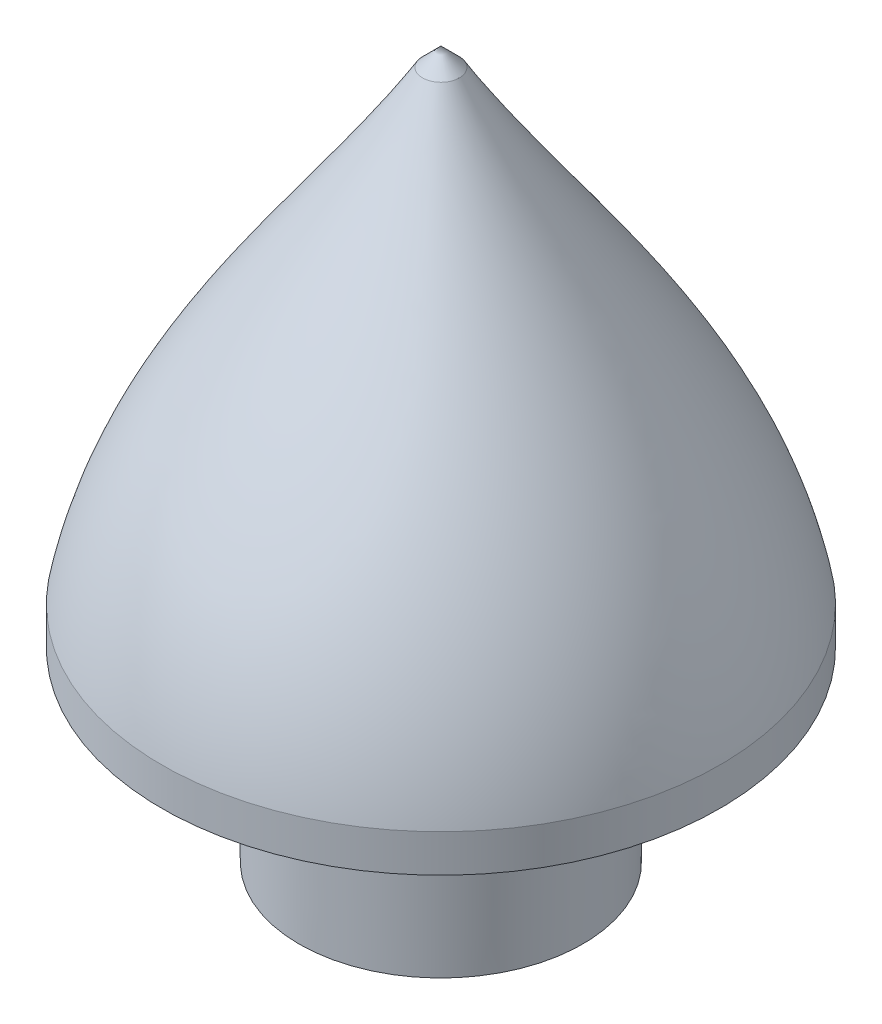
ISO-10303-21;
HEADER;
FILE_DESCRIPTION(('STEP AP214'),'2;1');
FILE_NAME('part.step','',(''),(''),'','','');
FILE_SCHEMA(('AUTOMOTIVE_DESIGN { 1 0 10303 214 1 1 1 1 }'));
ENDSEC;
DATA;
#1=APPLICATION_CONTEXT('core data for automotive mechanical design processes');
#2=APPLICATION_PROTOCOL_DEFINITION('international standard','automotive_design',2000,#1);
#3=PRODUCT_CONTEXT('',#1,'mechanical');
#4=PRODUCT('Part','Part','',(#3));
#5=PRODUCT_RELATED_PRODUCT_CATEGORY('part','',(#4));
#6=PRODUCT_DEFINITION_FORMATION('','',#4);
#7=PRODUCT_DEFINITION_CONTEXT('part definition',#1,'design');
#8=PRODUCT_DEFINITION('design','',#6,#7);
#9=PRODUCT_DEFINITION_SHAPE('','',#8);
#10=(LENGTH_UNIT() NAMED_UNIT(*) SI_UNIT(.MILLI.,.METRE.));
#11=(NAMED_UNIT(*) PLANE_ANGLE_UNIT() SI_UNIT($,.RADIAN.));
#12=(NAMED_UNIT(*) SI_UNIT($,.STERADIAN.) SOLID_ANGLE_UNIT());
#13=UNCERTAINTY_MEASURE_WITH_UNIT(LENGTH_MEASURE(1.E-05),#10,'distance_accuracy_value','');
#14=(GEOMETRIC_REPRESENTATION_CONTEXT(3) GLOBAL_UNCERTAINTY_ASSIGNED_CONTEXT((#13)) GLOBAL_UNIT_ASSIGNED_CONTEXT((#10,
#11,#12)) REPRESENTATION_CONTEXT('',''));
#15=CARTESIAN_POINT('',(0.,0.,0.));
#16=DIRECTION('',(0.,0.,1.));
#17=DIRECTION('',(1.,0.,0.));
#18=AXIS2_PLACEMENT_3D('',#15,#16,#17);
#19=CARTESIAN_POINT('',(-2.,0.,0.));
#20=DIRECTION('',(0.,1.,0.));
#21=DIRECTION('',(0.,0.,1.));
#22=AXIS2_PLACEMENT_3D('',#19,#20,#21);
#23=PLANE('',#22);
#24=CARTESIAN_POINT('',(0.,0.,0.));
#25=DIRECTION('',(0.,-1.,0.));
#26=DIRECTION('',(0.,0.,-1.));
#27=AXIS2_PLACEMENT_3D('',#24,#25,#26);
#28=CIRCLE('',#27,3.75);
#29=CARTESIAN_POINT('',(0.,0.,-3.75));
#30=VERTEX_POINT('',#29);
#31=EDGE_CURVE('E59',#30,#30,#28,.T.);
#32=ORIENTED_EDGE('',*,*,#31,.T.);
#33=EDGE_LOOP('',(#32));
#34=FACE_BOUND('',#33,.T.);
#35=CARTESIAN_POINT('',(0.,0.,0.));
#36=DIRECTION('',(0.,1.,0.));
#37=DIRECTION('',(0.,0.,1.));
#38=AXIS2_PLACEMENT_3D('',#35,#36,#37);
#39=CIRCLE('',#38,1.95);
#40=CARTESIAN_POINT('',(0.,0.,1.95));
#41=VERTEX_POINT('',#40);
#42=EDGE_CURVE('E11',#41,#41,#39,.F.);
#43=ORIENTED_EDGE('',*,*,#42,.F.);
#44=EDGE_LOOP('',(#43));
#45=FACE_BOUND('',#44,.T.);
#46=ADVANCED_FACE('F33',(#34,#45),#23,.F.);
#47=CARTESIAN_POINT('',(0.,7.,0.));
#48=DIRECTION('',(0.,-1.,0.));
#49=DIRECTION('',(0.,0.,-1.));
#50=AXIS2_PLACEMENT_3D('',#47,#48,#49);
#51=CONICAL_SURFACE('',#50,0.,0.785398163397438);
#52=CARTESIAN_POINT('',(0.,6.75257649370923,0.));
#53=DIRECTION('',(0.,-1.,0.));
#54=DIRECTION('',(0.,0.,-1.));
#55=AXIS2_PLACEMENT_3D('',#52,#53,#54);
#56=CIRCLE('',#55,0.247423506290761);
#57=CARTESIAN_POINT('',(0.,6.75257649370923,-0.247423506290761));
#58=VERTEX_POINT('',#57);
#59=EDGE_CURVE('E40',#58,#58,#56,.T.);
#60=ORIENTED_EDGE('',*,*,#59,.F.);
#61=EDGE_LOOP('',(#60));
#62=FACE_BOUND('',#61,.T.);
#63=CARTESIAN_POINT('',(0.,7.,0.));
#64=VERTEX_POINT('',#63);
#65=VERTEX_LOOP('',#64);
#66=FACE_BOUND('',#65,.T.);
#67=ADVANCED_FACE('F35',(#62,#66),#51,.T.);
#68=CARTESIAN_POINT('',(-0.247423506290761,6.75257649370924,0.));
#69=CARTESIAN_POINT('',(-1.47977646656717,4.70886286145873,0.));
#70=CARTESIAN_POINT('',(-3.28291831914856,2.94887927020943,0.));
#71=CARTESIAN_POINT('',(-3.75,0.506327417075365,0.));
#72=B_SPLINE_CURVE_WITH_KNOTS('',3,(#68,#69,#70,#71),.UNSPECIFIED.,.F.,.F.,(4,4),(0.,1.),.UNSPECIFIED.);
#73=CARTESIAN_POINT('',(0.,-2.,0.));
#74=DIRECTION('',(0.,-1.,0.));
#75=AXIS1_PLACEMENT('',#73,#74);
#76=SURFACE_OF_REVOLUTION('',#72,#75);
#77=CARTESIAN_POINT('',(0.,0.506327417075365,0.));
#78=DIRECTION('',(0.,-1.,0.));
#79=DIRECTION('',(0.,0.,-1.));
#80=AXIS2_PLACEMENT_3D('',#77,#78,#79);
#81=CIRCLE('',#80,3.75);
#82=CARTESIAN_POINT('',(0.,0.506327417075365,-3.75));
#83=VERTEX_POINT('',#82);
#84=EDGE_CURVE('E57',#83,#83,#81,.T.);
#85=ORIENTED_EDGE('',*,*,#84,.F.);
#86=EDGE_LOOP('',(#85));
#87=FACE_BOUND('',#86,.T.);
#88=ORIENTED_EDGE('',*,*,#59,.T.);
#89=EDGE_LOOP('',(#88));
#90=FACE_BOUND('',#89,.T.);
#91=ADVANCED_FACE('F44',(#87,#90),#76,.T.);
#92=CARTESIAN_POINT('',(0.,-2.,0.));
#93=DIRECTION('',(0.,-1.,0.));
#94=DIRECTION('',(0.,0.,-1.));
#95=AXIS2_PLACEMENT_3D('',#92,#93,#94);
#96=CYLINDRICAL_SURFACE('',#95,3.75);
#97=ORIENTED_EDGE('',*,*,#31,.F.);
#98=EDGE_LOOP('',(#97));
#99=FACE_BOUND('',#98,.T.);
#100=ORIENTED_EDGE('',*,*,#84,.T.);
#101=EDGE_LOOP('',(#100));
#102=FACE_BOUND('',#101,.T.);
#103=ADVANCED_FACE('F50',(#99,#102),#96,.T.);
#104=CARTESIAN_POINT('',(0.,0.,0.));
#105=DIRECTION('',(0.,1.,0.));
#106=DIRECTION('',(0.,0.,-1.));
#107=AXIS2_PLACEMENT_3D('',#104,#105,#106);
#108=CONICAL_SURFACE('',#107,1.95,0.0174532925199433);
#109=CARTESIAN_POINT('',(0.,-2.5,0.));
#110=DIRECTION('',(0.,-1.,0.));
#111=DIRECTION('',(0.,0.,-1.));
#112=AXIS2_PLACEMENT_3D('',#109,#110,#111);
#113=CIRCLE('',#112,1.90636233767946);
#114=CARTESIAN_POINT('',(0.,-2.5,-1.90636233767946));
#115=VERTEX_POINT('',#114);
#116=EDGE_CURVE('E64',#115,#115,#113,.T.);
#117=ORIENTED_EDGE('',*,*,#116,.F.);
#118=EDGE_LOOP('',(#117));
#119=FACE_BOUND('',#118,.T.);
#120=ORIENTED_EDGE('',*,*,#42,.T.);
#121=EDGE_LOOP('',(#120));
#122=FACE_BOUND('',#121,.T.);
#123=ADVANCED_FACE('F74',(#119,#122),#108,.T.);
#124=CARTESIAN_POINT('',(0.,-2.5,0.));
#125=DIRECTION('',(0.,-1.,0.));
#126=DIRECTION('',(0.,0.,-1.));
#127=AXIS2_PLACEMENT_3D('',#124,#125,#126);
#128=PLANE('',#127);
#129=ORIENTED_EDGE('',*,*,#116,.T.);
#130=EDGE_LOOP('',(#129));
#131=FACE_BOUND('',#130,.T.);
#132=ADVANCED_FACE('F79',(#131),#128,.T.);
#133=CLOSED_SHELL('',(#46,#67,#91,#103,#123,#132));
#134=MANIFOLD_SOLID_BREP('B2',#133);
#135=ADVANCED_BREP_SHAPE_REPRESENTATION('',(#18,#134),#14);
#136=SHAPE_DEFINITION_REPRESENTATION(#9,#135);
ENDSEC;
END-ISO-10303-21;
